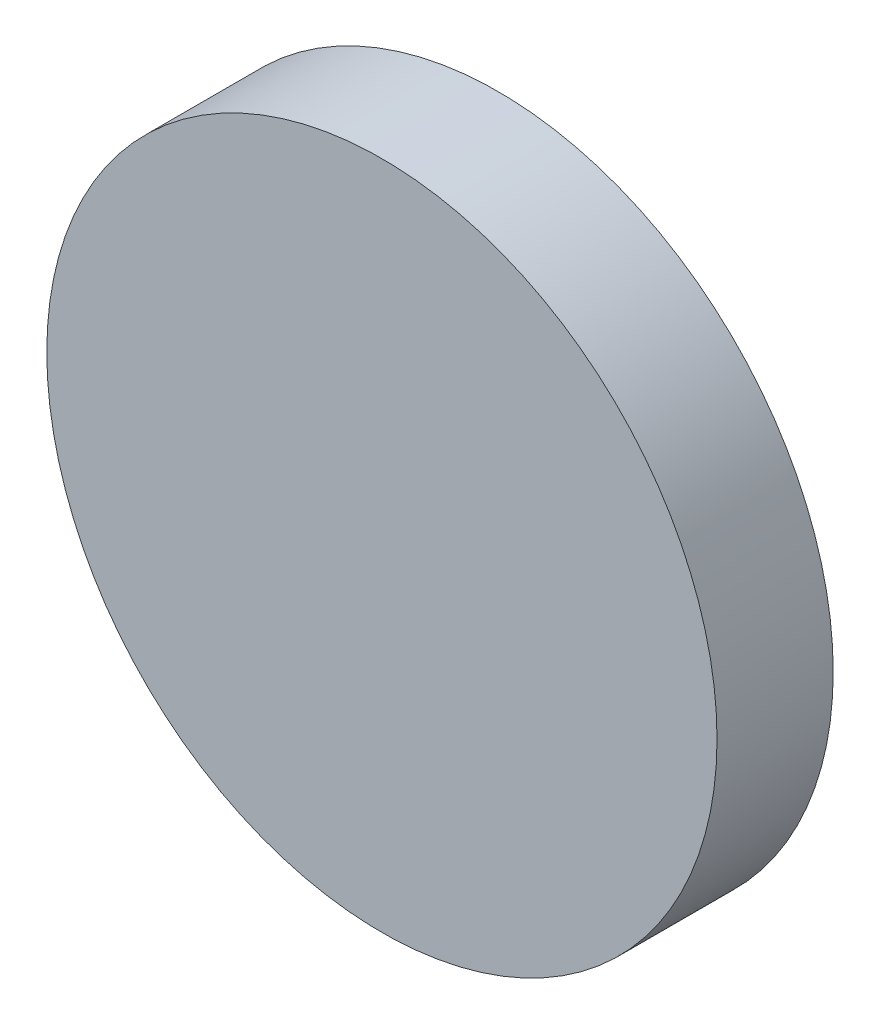
ISO-10303-21;
HEADER;
FILE_DESCRIPTION(('STEP AP214'),'2;1');
FILE_NAME('part.step','',(''),(''),'','','');
FILE_SCHEMA(('AUTOMOTIVE_DESIGN { 1 0 10303 214 1 1 1 1 }'));
ENDSEC;
DATA;
#1=APPLICATION_CONTEXT('core data for automotive mechanical design processes');
#2=APPLICATION_PROTOCOL_DEFINITION('international standard','automotive_design',2000,#1);
#3=PRODUCT_CONTEXT('',#1,'mechanical');
#4=PRODUCT('Part','Part','',(#3));
#5=PRODUCT_RELATED_PRODUCT_CATEGORY('part','',(#4));
#6=PRODUCT_DEFINITION_FORMATION('','',#4);
#7=PRODUCT_DEFINITION_CONTEXT('part definition',#1,'design');
#8=PRODUCT_DEFINITION('design','',#6,#7);
#9=PRODUCT_DEFINITION_SHAPE('','',#8);
#10=(LENGTH_UNIT() NAMED_UNIT(*) SI_UNIT(.MILLI.,.METRE.));
#11=(NAMED_UNIT(*) PLANE_ANGLE_UNIT() SI_UNIT($,.RADIAN.));
#12=(NAMED_UNIT(*) SI_UNIT($,.STERADIAN.) SOLID_ANGLE_UNIT());
#13=UNCERTAINTY_MEASURE_WITH_UNIT(LENGTH_MEASURE(1.E-05),#10,'distance_accuracy_value','');
#14=(GEOMETRIC_REPRESENTATION_CONTEXT(3) GLOBAL_UNCERTAINTY_ASSIGNED_CONTEXT((#13)) GLOBAL_UNIT_ASSIGNED_CONTEXT((#10,
#11,#12)) REPRESENTATION_CONTEXT('',''));
#15=CARTESIAN_POINT('',(0.,0.,0.));
#16=DIRECTION('',(0.,0.,1.));
#17=DIRECTION('',(1.,0.,0.));
#18=AXIS2_PLACEMENT_3D('',#15,#16,#17);
#19=CARTESIAN_POINT('',(0.,0.,-12.7));
#20=DIRECTION('',(0.,0.,1.));
#21=DIRECTION('',(1.,0.,0.));
#22=AXIS2_PLACEMENT_3D('',#19,#20,#21);
#23=CYLINDRICAL_SURFACE('',#22,44.45);
#24=CARTESIAN_POINT('',(0.,0.,-12.7));
#25=DIRECTION('',(0.,0.,-1.));
#26=DIRECTION('',(-1.,0.,0.));
#27=AXIS2_PLACEMENT_3D('',#24,#25,#26);
#28=CIRCLE('',#27,44.45);
#29=CARTESIAN_POINT('',(-44.45,0.,-12.7));
#30=VERTEX_POINT('',#29);
#31=EDGE_CURVE('E97',#30,#30,#28,.T.);
#32=ORIENTED_EDGE('',*,*,#31,.T.);
#33=EDGE_LOOP('',(#32));
#34=FACE_BOUND('',#33,.T.);
#35=CARTESIAN_POINT('',(0.,0.,-5.08));
#36=DIRECTION('',(0.,0.,1.));
#37=DIRECTION('',(1.,0.,0.));
#38=AXIS2_PLACEMENT_3D('',#35,#36,#37);
#39=CIRCLE('',#38,44.45);
#40=CARTESIAN_POINT('',(-44.4453985934735,-0.639565373724559,-5.08));
#41=VERTEX_POINT('',#40);
#42=CARTESIAN_POINT('',(-44.3842075254675,-2.41756537372456,-5.08));
#43=VERTEX_POINT('',#42);
#44=EDGE_CURVE('E11',#41,#43,#39,.T.);
#45=ORIENTED_EDGE('',*,*,#44,.T.);
#46=DIRECTION('',(0.,0.,1.));
#47=VECTOR('',#46,1.);
#48=CARTESIAN_POINT('',(-44.3842075254675,-2.41756537372456,-12.7));
#49=LINE('',#48,#47);
#50=CARTESIAN_POINT('',(-44.3842075254675,-2.41756537372456,0.));
#51=VERTEX_POINT('',#50);
#52=EDGE_CURVE('E58',#43,#51,#49,.T.);
#53=ORIENTED_EDGE('',*,*,#52,.T.);
#54=CARTESIAN_POINT('',(0.,0.,0.));
#55=DIRECTION('',(0.,0.,-1.));
#56=DIRECTION('',(-1.,0.,0.));
#57=AXIS2_PLACEMENT_3D('',#54,#55,#56);
#58=CIRCLE('',#57,44.45);
#59=CARTESIAN_POINT('',(44.3842075254675,-2.41756537372456,0.));
#60=VERTEX_POINT('',#59);
#61=EDGE_CURVE('E101',#60,#51,#58,.T.);
#62=ORIENTED_EDGE('',*,*,#61,.F.);
#63=DIRECTION('',(0.,0.,1.));
#64=VECTOR('',#63,1.);
#65=CARTESIAN_POINT('',(44.3842075254675,-2.41756537372456,-12.7));
#66=LINE('',#65,#64);
#67=CARTESIAN_POINT('',(44.3842075254675,-2.41756537372456,-5.08));
#68=VERTEX_POINT('',#67);
#69=EDGE_CURVE('E90',#60,#68,#66,.F.);
#70=ORIENTED_EDGE('',*,*,#69,.T.);
#71=CARTESIAN_POINT('',(44.4453985934735,-0.639565373724559,-5.08));
#72=VERTEX_POINT('',#71);
#73=EDGE_CURVE('E39',#68,#72,#39,.T.);
#74=ORIENTED_EDGE('',*,*,#73,.T.);
#75=DIRECTION('',(0.,0.,1.));
#76=VECTOR('',#75,1.);
#77=CARTESIAN_POINT('',(44.4453985934735,-0.639565373724559,-12.7));
#78=LINE('',#77,#76);
#79=CARTESIAN_POINT('',(44.4453985934735,-0.639565373724559,0.));
#80=VERTEX_POINT('',#79);
#81=EDGE_CURVE('E84',#80,#72,#78,.F.);
#82=ORIENTED_EDGE('',*,*,#81,.F.);
#83=CARTESIAN_POINT('',(-44.4453985934735,-0.639565373724559,0.));
#84=VERTEX_POINT('',#83);
#85=EDGE_CURVE('E88',#84,#80,#58,.T.);
#86=ORIENTED_EDGE('',*,*,#85,.F.);
#87=DIRECTION('',(0.,0.,1.));
#88=VECTOR('',#87,1.);
#89=CARTESIAN_POINT('',(-44.4453985934735,-0.639565373724559,-5.08));
#90=LINE('',#89,#88);
#91=EDGE_CURVE('E50',#41,#84,#90,.T.);
#92=ORIENTED_EDGE('',*,*,#91,.F.);
#93=EDGE_LOOP('',(#45,#53,#62,#70,#74,#82,#86,#92));
#94=FACE_BOUND('',#93,.T.);
#95=ADVANCED_FACE('F35',(#34,#94),#23,.F.);
#96=CARTESIAN_POINT('',(0.,0.,0.));
#97=DIRECTION('',(0.,0.,1.));
#98=DIRECTION('',(1.,0.,0.));
#99=AXIS2_PLACEMENT_3D('',#96,#97,#98);
#100=PLANE('',#99);
#101=DIRECTION('',(-1.,0.,0.));
#102=VECTOR('',#101,1.);
#103=CARTESIAN_POINT('',(0.,-2.41756537372456,0.));
#104=LINE('',#103,#102);
#105=EDGE_CURVE('E109',#60,#51,#104,.T.);
#106=ORIENTED_EDGE('',*,*,#105,.F.);
#107=ORIENTED_EDGE('',*,*,#61,.T.);
#108=EDGE_LOOP('',(#106,#107));
#109=FACE_BOUND('',#108,.T.);
#110=ADVANCED_FACE('F115',(#109),#100,.F.);
#111=CARTESIAN_POINT('',(0.,0.,3.81));
#112=DIRECTION('',(0.,0.,-1.));
#113=DIRECTION('',(-1.,0.,0.));
#114=AXIS2_PLACEMENT_3D('',#111,#112,#113);
#115=CYLINDRICAL_SURFACE('',#114,47.625);
#116=CARTESIAN_POINT('',(0.,0.,3.81));
#117=DIRECTION('',(0.,0.,1.));
#118=DIRECTION('',(1.,0.,0.));
#119=AXIS2_PLACEMENT_3D('',#116,#117,#118);
#120=CIRCLE('',#119,47.625);
#121=CARTESIAN_POINT('',(-47.625,0.,3.81));
#122=VERTEX_POINT('',#121);
#123=EDGE_CURVE('E105',#122,#122,#120,.T.);
#124=CARTESIAN_POINT('',(0.,0.,-12.7));
#125=DIRECTION('',(0.,0.,-1.));
#126=DIRECTION('',(-1.,0.,0.));
#127=AXIS2_PLACEMENT_3D('',#124,#125,#126);
#128=CIRCLE('',#127,47.625);
#129=CARTESIAN_POINT('',(-47.625,0.,-12.7));
#130=VERTEX_POINT('',#129);
#131=EDGE_CURVE('E100',#130,#130,#128,.T.);
#132=CARTESIAN_POINT('',(-47.625,0.,3.81));
#133=CARTESIAN_POINT('',(-47.625,0.,3.63802083333333));
#134=CARTESIAN_POINT('',(-47.625,0.,3.46604166666667));
#135=CARTESIAN_POINT('',(-47.625,0.,3.12208333333333));
#136=CARTESIAN_POINT('',(-47.625,0.,2.95010416666667));
#137=CARTESIAN_POINT('',(-47.625,0.,2.60614583333333));
#138=CARTESIAN_POINT('',(-47.625,0.,2.43416666666667));
#139=CARTESIAN_POINT('',(-47.625,0.,2.09020833333333));
#140=CARTESIAN_POINT('',(-47.625,0.,1.91822916666667));
#141=CARTESIAN_POINT('',(-47.625,0.,1.57427083333333));
#142=CARTESIAN_POINT('',(-47.625,0.,1.40229166666667));
#143=CARTESIAN_POINT('',(-47.625,0.,1.05833333333333));
#144=CARTESIAN_POINT('',(-47.625,0.,0.886354166666666));
#145=CARTESIAN_POINT('',(-47.625,0.,0.542395833333332));
#146=CARTESIAN_POINT('',(-47.625,0.,0.370416666666665));
#147=CARTESIAN_POINT('',(-47.625,0.,0.0264583333333322));
#148=CARTESIAN_POINT('',(-47.625,0.,-0.145520833333334));
#149=CARTESIAN_POINT('',(-47.625,0.,-0.489479166666667));
#150=CARTESIAN_POINT('',(-47.625,0.,-0.661458333333334));
#151=CARTESIAN_POINT('',(-47.625,0.,-1.00541666666667));
#152=CARTESIAN_POINT('',(-47.625,0.,-1.17739583333333));
#153=CARTESIAN_POINT('',(-47.625,0.,-1.52135416666667));
#154=CARTESIAN_POINT('',(-47.625,0.,-1.69333333333333));
#155=CARTESIAN_POINT('',(-47.625,0.,-2.03729166666667));
#156=CARTESIAN_POINT('',(-47.625,0.,-2.20927083333333));
#157=CARTESIAN_POINT('',(-47.625,0.,-2.55322916666667));
#158=CARTESIAN_POINT('',(-47.625,0.,-2.72520833333333));
#159=CARTESIAN_POINT('',(-47.625,0.,-3.06916666666667));
#160=CARTESIAN_POINT('',(-47.625,0.,-3.24114583333333));
#161=CARTESIAN_POINT('',(-47.625,0.,-3.58510416666667));
#162=CARTESIAN_POINT('',(-47.625,0.,-3.75708333333334));
#163=CARTESIAN_POINT('',(-47.625,0.,-4.10104166666667));
#164=CARTESIAN_POINT('',(-47.625,0.,-4.27302083333333));
#165=CARTESIAN_POINT('',(-47.625,0.,-4.61697916666667));
#166=CARTESIAN_POINT('',(-47.625,0.,-4.78895833333334));
#167=CARTESIAN_POINT('',(-47.625,0.,-5.13291666666667));
#168=CARTESIAN_POINT('',(-47.625,0.,-5.30489583333333));
#169=CARTESIAN_POINT('',(-47.625,0.,-5.64885416666667));
#170=CARTESIAN_POINT('',(-47.625,0.,-5.82083333333333));
#171=CARTESIAN_POINT('',(-47.625,0.,-6.16479166666667));
#172=CARTESIAN_POINT('',(-47.625,0.,-6.33677083333333));
#173=CARTESIAN_POINT('',(-47.625,0.,-6.68072916666667));
#174=CARTESIAN_POINT('',(-47.625,0.,-6.85270833333333));
#175=CARTESIAN_POINT('',(-47.625,0.,-7.19666666666667));
#176=CARTESIAN_POINT('',(-47.625,0.,-7.36864583333334));
#177=CARTESIAN_POINT('',(-47.625,0.,-7.71260416666667));
#178=CARTESIAN_POINT('',(-47.625,0.,-7.88458333333334));
#179=CARTESIAN_POINT('',(-47.625,0.,-8.22854166666667));
#180=CARTESIAN_POINT('',(-47.625,0.,-8.40052083333333));
#181=CARTESIAN_POINT('',(-47.625,0.,-8.74447916666667));
#182=CARTESIAN_POINT('',(-47.625,0.,-8.91645833333333));
#183=CARTESIAN_POINT('',(-47.625,0.,-9.26041666666667));
#184=CARTESIAN_POINT('',(-47.625,0.,-9.43239583333334));
#185=CARTESIAN_POINT('',(-47.625,0.,-9.77635416666667));
#186=CARTESIAN_POINT('',(-47.625,0.,-9.94833333333334));
#187=CARTESIAN_POINT('',(-47.625,0.,-10.2922916666667));
#188=CARTESIAN_POINT('',(-47.625,0.,-10.4642708333333));
#189=CARTESIAN_POINT('',(-47.625,0.,-10.8082291666667));
#190=CARTESIAN_POINT('',(-47.625,0.,-10.9802083333333));
#191=CARTESIAN_POINT('',(-47.625,0.,-11.3241666666667));
#192=CARTESIAN_POINT('',(-47.625,0.,-11.4961458333333));
#193=CARTESIAN_POINT('',(-47.625,0.,-11.8401041666667));
#194=CARTESIAN_POINT('',(-47.625,0.,-12.0120833333333));
#195=CARTESIAN_POINT('',(-47.625,0.,-12.3560416666667));
#196=CARTESIAN_POINT('',(-47.625,0.,-12.5280208333333));
#197=CARTESIAN_POINT('',(-47.625,0.,-12.7));
#198=B_SPLINE_CURVE_WITH_KNOTS('',3,(#132,#133,#134,#135,#136,#137,#138,#139,#140,#141,#142,
#143,#144,#145,#146,#147,#148,#149,#150,#151,#152,#153,#154,#155,#156,#157,#158,#159,#160,#161,
#162,#163,#164,#165,#166,#167,#168,#169,#170,#171,#172,#173,#174,#175,#176,#177,#178,#179,#180,
#181,#182,#183,#184,#185,#186,#187,#188,#189,#190,#191,#192,#193,#194,#195,#196,#197),
.UNSPECIFIED.,.F.,.F.,(4,2,2,2,2,2,2,2,2,2,2,2,2,2,2,2,2,2,2,2,2,2,2,2,2,2,2,2,2,2,2,2,4),(0.,
0.5159375,1.031875,1.5478125,2.06375,2.5796875,3.095625,3.6115625,4.1275,4.6434375,5.159375,
5.6753125,6.19125,6.7071875,7.223125,7.7390625,8.255,8.7709375,9.286875,9.8028125,10.31875,
10.8346875,11.350625,11.8665625,12.3825,12.8984375,13.414375,13.9303125,14.44625,14.9621875,
15.478125,15.9940625,16.51),.UNSPECIFIED.);
#199=EDGE_CURVE('BSEAM37',#122,#130,#198,.T.);
#200=ORIENTED_EDGE('',*,*,#123,.F.);
#201=ORIENTED_EDGE('',*,*,#131,.F.);
#202=ORIENTED_EDGE('',*,*,#199,.T.);
#203=ORIENTED_EDGE('',*,*,#199,.F.);
#204=EDGE_LOOP('',(#200,#202,#201,#203));
#205=FACE_BOUND('',#204,.T.);
#206=ADVANCED_FACE('F37',(#205),#115,.T.);
#207=CARTESIAN_POINT('',(0.,0.,3.81));
#208=DIRECTION('',(0.,0.,1.));
#209=DIRECTION('',(1.,0.,0.));
#210=AXIS2_PLACEMENT_3D('',#207,#208,#209);
#211=PLANE('',#210);
#212=ORIENTED_EDGE('',*,*,#123,.T.);
#213=EDGE_LOOP('',(#212));
#214=FACE_BOUND('',#213,.T.);
#215=ADVANCED_FACE('F122',(#214),#211,.T.);
#216=CARTESIAN_POINT('',(0.,0.,-12.7));
#217=DIRECTION('',(0.,0.,-1.));
#218=DIRECTION('',(-1.,0.,0.));
#219=AXIS2_PLACEMENT_3D('',#216,#217,#218);
#220=PLANE('',#219);
#221=ORIENTED_EDGE('',*,*,#131,.T.);
#222=EDGE_LOOP('',(#221));
#223=FACE_BOUND('',#222,.T.);
#224=ORIENTED_EDGE('',*,*,#31,.F.);
#225=EDGE_LOOP('',(#224));
#226=FACE_BOUND('',#225,.T.);
#227=ADVANCED_FACE('F128',(#223,#226),#220,.T.);
#228=ORIENTED_EDGE('',*,*,#85,.T.);
#229=DIRECTION('',(-1.,0.,0.));
#230=VECTOR('',#229,1.);
#231=CARTESIAN_POINT('',(0.,-0.639565373724559,0.));
#232=LINE('',#231,#230);
#233=EDGE_CURVE('E108',#80,#84,#232,.T.);
#234=ORIENTED_EDGE('',*,*,#233,.T.);
#235=EDGE_LOOP('',(#228,#234));
#236=FACE_BOUND('',#235,.T.);
#237=ADVANCED_FACE('F117',(#236),#100,.F.);
#238=CARTESIAN_POINT('',(0.,0.,-5.08));
#239=DIRECTION('',(0.,0.,1.));
#240=DIRECTION('',(1.,0.,0.));
#241=AXIS2_PLACEMENT_3D('',#238,#239,#240);
#242=PLANE('',#241);
#243=ORIENTED_EDGE('',*,*,#44,.F.);
#244=DIRECTION('',(-1.,0.,0.));
#245=VECTOR('',#244,1.);
#246=CARTESIAN_POINT('',(44.4546014065265,-0.639565373724559,-5.08));
#247=LINE('',#246,#245);
#248=EDGE_CURVE('E78',#72,#41,#247,.T.);
#249=ORIENTED_EDGE('',*,*,#248,.F.);
#250=ORIENTED_EDGE('',*,*,#73,.F.);
#251=DIRECTION('',(-1.,0.,0.));
#252=VECTOR('',#251,1.);
#253=CARTESIAN_POINT('',(44.4546014065265,-2.41756537372456,-5.08));
#254=LINE('',#253,#252);
#255=EDGE_CURVE('E80',#68,#43,#254,.T.);
#256=ORIENTED_EDGE('',*,*,#255,.T.);
#257=EDGE_LOOP('',(#243,#249,#250,#256));
#258=FACE_BOUND('',#257,.T.);
#259=ADVANCED_FACE('F77',(#258),#242,.F.);
#260=CARTESIAN_POINT('',(44.4546014065265,-2.41756537372456,-5.08));
#261=DIRECTION('',(0.,1.,0.));
#262=DIRECTION('',(0.,0.,1.));
#263=AXIS2_PLACEMENT_3D('',#260,#261,#262);
#264=PLANE('',#263);
#265=ORIENTED_EDGE('',*,*,#52,.F.);
#266=ORIENTED_EDGE('',*,*,#255,.F.);
#267=ORIENTED_EDGE('',*,*,#69,.F.);
#268=ORIENTED_EDGE('',*,*,#105,.T.);
#269=EDGE_LOOP('',(#265,#266,#267,#268));
#270=FACE_BOUND('',#269,.T.);
#271=ADVANCED_FACE('F112',(#270),#264,.F.);
#272=CARTESIAN_POINT('',(44.4546014065265,-0.639565373724559,-5.08));
#273=DIRECTION('',(0.,1.,0.));
#274=DIRECTION('',(0.,0.,1.));
#275=AXIS2_PLACEMENT_3D('',#272,#273,#274);
#276=PLANE('',#275);
#277=ORIENTED_EDGE('',*,*,#233,.F.);
#278=ORIENTED_EDGE('',*,*,#81,.T.);
#279=ORIENTED_EDGE('',*,*,#248,.T.);
#280=ORIENTED_EDGE('',*,*,#91,.T.);
#281=EDGE_LOOP('',(#277,#278,#279,#280));
#282=FACE_BOUND('',#281,.T.);
#283=ADVANCED_FACE('F82',(#282),#276,.T.);
#284=CLOSED_SHELL('',(#95,#110,#206,#215,#227,#237,#259,#271,#283));
#285=MANIFOLD_SOLID_BREP('B2',#284);
#286=ADVANCED_BREP_SHAPE_REPRESENTATION('',(#18,#285),#14);
#287=SHAPE_DEFINITION_REPRESENTATION(#9,#286);
ENDSEC;
END-ISO-10303-21;
